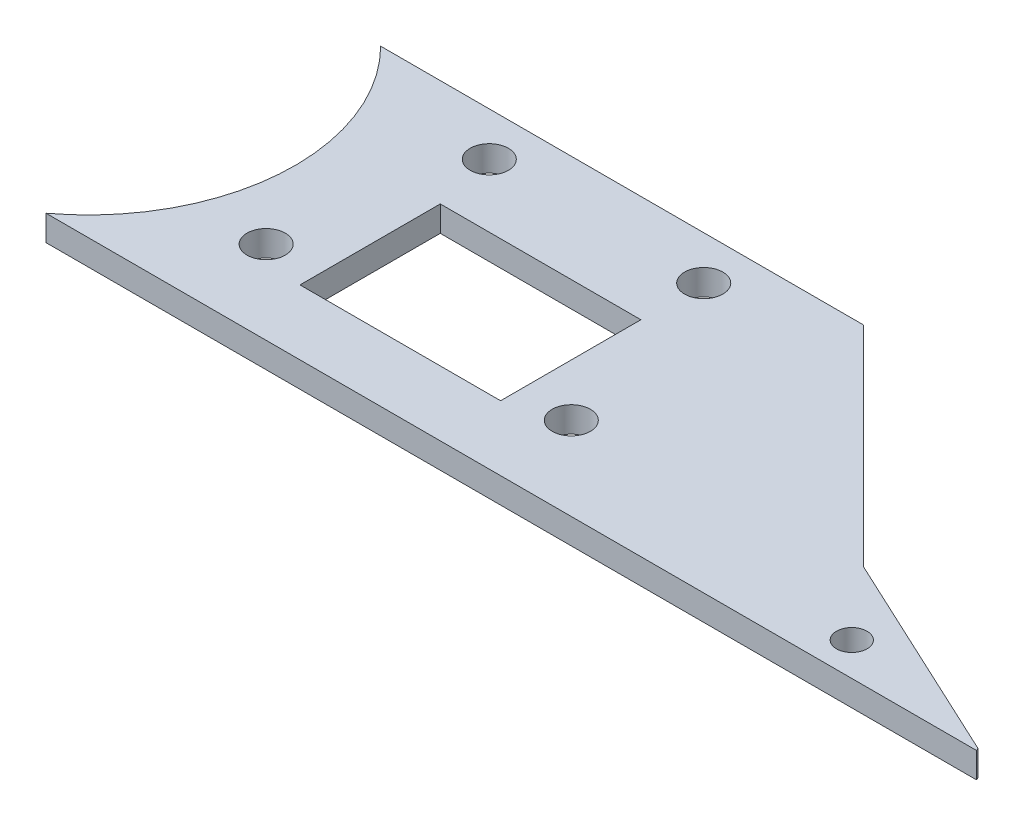
ISO-10303-21;
HEADER;
FILE_DESCRIPTION(('STEP AP214'),'2;1');
FILE_NAME('part.step','',(''),(''),'','','');
FILE_SCHEMA(('AUTOMOTIVE_DESIGN { 1 0 10303 214 1 1 1 1 }'));
ENDSEC;
DATA;
#1=APPLICATION_CONTEXT('core data for automotive mechanical design processes');
#2=APPLICATION_PROTOCOL_DEFINITION('international standard','automotive_design',2000,#1);
#3=PRODUCT_CONTEXT('',#1,'mechanical');
#4=PRODUCT('Part','Part','',(#3));
#5=PRODUCT_RELATED_PRODUCT_CATEGORY('part','',(#4));
#6=PRODUCT_DEFINITION_FORMATION('','',#4);
#7=PRODUCT_DEFINITION_CONTEXT('part definition',#1,'design');
#8=PRODUCT_DEFINITION('design','',#6,#7);
#9=PRODUCT_DEFINITION_SHAPE('','',#8);
#10=(LENGTH_UNIT() NAMED_UNIT(*) SI_UNIT(.MILLI.,.METRE.));
#11=(NAMED_UNIT(*) PLANE_ANGLE_UNIT() SI_UNIT($,.RADIAN.));
#12=(NAMED_UNIT(*) SI_UNIT($,.STERADIAN.) SOLID_ANGLE_UNIT());
#13=UNCERTAINTY_MEASURE_WITH_UNIT(LENGTH_MEASURE(1.E-05),#10,'distance_accuracy_value','');
#14=(GEOMETRIC_REPRESENTATION_CONTEXT(3) GLOBAL_UNCERTAINTY_ASSIGNED_CONTEXT((#13)) GLOBAL_UNIT_ASSIGNED_CONTEXT((#10,
#11,#12)) REPRESENTATION_CONTEXT('',''));
#15=CARTESIAN_POINT('',(0.,0.,0.));
#16=DIRECTION('',(0.,0.,1.));
#17=DIRECTION('',(1.,0.,0.));
#18=AXIS2_PLACEMENT_3D('',#15,#16,#17);
#19=CARTESIAN_POINT('',(-66.6007874639378,2.,10.8319569581962));
#20=DIRECTION('',(0.,1.,0.));
#21=DIRECTION('',(0.,0.,1.));
#22=AXIS2_PLACEMENT_3D('',#19,#20,#21);
#23=PLANE('',#22);
#24=CARTESIAN_POINT('',(3.65105756173379,2.,21.2246917080229));
#25=DIRECTION('',(0.,1.,0.));
#26=DIRECTION('',(0.,0.,1.));
#27=AXIS2_PLACEMENT_3D('',#24,#25,#26);
#28=CIRCLE('',#27,1.2);
#29=CARTESIAN_POINT('',(3.65105756173379,2.,22.4246917080229));
#30=VERTEX_POINT('',#29);
#31=EDGE_CURVE('E121',#30,#30,#28,.T.);
#32=ORIENTED_EDGE('',*,*,#31,.F.);
#33=EDGE_LOOP('',(#32));
#34=FACE_BOUND('',#33,.T.);
#35=CARTESIAN_POINT('',(-46.1933078237589,2.,17.2995690503924));
#36=DIRECTION('',(0.,1.,0.));
#37=DIRECTION('',(0.,0.,1.));
#38=AXIS2_PLACEMENT_3D('',#35,#36,#37);
#39=CIRCLE('',#38,1.5);
#40=CARTESIAN_POINT('',(-46.1933078237589,2.,18.7995690503924));
#41=VERTEX_POINT('',#40);
#42=EDGE_CURVE('E373',#41,#41,#39,.T.);
#43=ORIENTED_EDGE('',*,*,#42,.F.);
#44=EDGE_LOOP('',(#43));
#45=FACE_BOUND('',#44,.T.);
#46=CARTESIAN_POINT('',(-43.205666325321,2.,2.78979940431926));
#47=DIRECTION('',(0.,1.,0.));
#48=DIRECTION('',(0.,0.,1.));
#49=AXIS2_PLACEMENT_3D('',#46,#47,#48);
#50=CIRCLE('',#49,1.5);
#51=CARTESIAN_POINT('',(-43.205666325321,2.,4.28979940431926));
#52=VERTEX_POINT('',#51);
#53=EDGE_CURVE('E385',#52,#52,#50,.T.);
#54=ORIENTED_EDGE('',*,*,#53,.F.);
#55=EDGE_LOOP('',(#54));
#56=FACE_BOUND('',#55,.T.);
#57=DIRECTION('',(-1.,0.,0.));
#58=VECTOR('',#57,1.);
#59=CARTESIAN_POINT('',(-26.3661735280737,2.,7.74257945205895));
#60=LINE('',#59,#58);
#61=CARTESIAN_POINT('',(-26.3661735280737,2.,7.74257945205895));
#62=VERTEX_POINT('',#61);
#63=CARTESIAN_POINT('',(-42.096785232211,2.,7.74257945205895));
#64=VERTEX_POINT('',#63);
#65=EDGE_CURVE('E393',#62,#64,#60,.T.);
#66=ORIENTED_EDGE('',*,*,#65,.F.);
#67=DIRECTION('',(0.,0.,-1.));
#68=VECTOR('',#67,1.);
#69=CARTESIAN_POINT('',(-26.3661735280737,2.,7.74257945205895));
#70=LINE('',#69,#68);
#71=CARTESIAN_POINT('',(-26.3661735280737,2.,18.7425794520587));
#72=VERTEX_POINT('',#71);
#73=EDGE_CURVE('E391',#72,#62,#70,.T.);
#74=ORIENTED_EDGE('',*,*,#73,.F.);
#75=DIRECTION('',(1.,0.,0.));
#76=VECTOR('',#75,1.);
#77=CARTESIAN_POINT('',(-26.3661735280737,2.,18.7425794520587));
#78=LINE('',#77,#76);
#79=CARTESIAN_POINT('',(-42.096785232211,2.,18.7425794520587));
#80=VERTEX_POINT('',#79);
#81=EDGE_CURVE('E398',#80,#72,#78,.T.);
#82=ORIENTED_EDGE('',*,*,#81,.F.);
#83=DIRECTION('',(0.,0.,1.));
#84=VECTOR('',#83,1.);
#85=CARTESIAN_POINT('',(-42.096785232211,2.,7.74257945205895));
#86=LINE('',#85,#84);
#87=EDGE_CURVE('E396',#64,#80,#86,.T.);
#88=ORIENTED_EDGE('',*,*,#87,.F.);
#89=EDGE_LOOP('',(#66,#74,#82,#88));
#90=FACE_BOUND('',#89,.T.);
#91=CARTESIAN_POINT('',(-26.3930466209632,2.,2.78979940431926));
#92=DIRECTION('',(0.,1.,0.));
#93=DIRECTION('',(0.,0.,1.));
#94=AXIS2_PLACEMENT_3D('',#91,#92,#93);
#95=CIRCLE('',#94,1.5);
#96=CARTESIAN_POINT('',(-26.3930466209632,2.,4.28979940431925));
#97=VERTEX_POINT('',#96);
#98=EDGE_CURVE('E379',#97,#97,#95,.T.);
#99=ORIENTED_EDGE('',*,*,#98,.F.);
#100=EDGE_LOOP('',(#99));
#101=FACE_BOUND('',#100,.T.);
#102=CARTESIAN_POINT('',(-22.2661735280737,2.,17.2995690503924));
#103=DIRECTION('',(0.,1.,0.));
#104=DIRECTION('',(0.,0.,1.));
#105=AXIS2_PLACEMENT_3D('',#102,#103,#104);
#106=CIRCLE('',#105,1.5);
#107=CARTESIAN_POINT('',(-22.2661735280737,2.,18.7995690503924));
#108=VERTEX_POINT('',#107);
#109=EDGE_CURVE('E367',#108,#108,#106,.T.);
#110=ORIENTED_EDGE('',*,*,#109,.F.);
#111=EDGE_LOOP('',(#110));
#112=FACE_BOUND('',#111,.T.);
#113=DIRECTION('',(1.,0.,0.));
#114=VECTOR('',#113,1.);
#115=CARTESIAN_POINT('',(-56.923759365185,2.,23.8319569582002));
#116=LINE('',#115,#114);
#117=CARTESIAN_POINT('',(-56.923759365185,2.,23.8319569582002));
#118=VERTEX_POINT('',#117);
#119=CARTESIAN_POINT('',(16.0318963530946,2.,23.8319569582002));
#120=VERTEX_POINT('',#119);
#121=EDGE_CURVE('E142',#118,#120,#116,.T.);
#122=ORIENTED_EDGE('',*,*,#121,.T.);
#123=DIRECTION('',(-0.342020143325665,0.,-0.93969262078591));
#124=VECTOR('',#123,1.);
#125=CARTESIAN_POINT('',(2.18758911063748,2.,-14.2049645784433));
#126=LINE('',#125,#124);
#127=CARTESIAN_POINT('',(15.9601451609682,2.,23.6348221780139));
#128=VERTEX_POINT('',#127);
#129=EDGE_CURVE('E53',#120,#128,#126,.T.);
#130=ORIENTED_EDGE('',*,*,#129,.T.);
#131=DIRECTION('',(-0.906307787036571,0.,-0.422618261740869));
#132=VECTOR('',#131,1.);
#133=CARTESIAN_POINT('',(16.3829020613507,2.,23.8319569582002));
#134=LINE('',#133,#132);
#135=CARTESIAN_POINT('',(-0.836945892341522,2.,15.8022099851249));
#136=VERTEX_POINT('',#135);
#137=EDGE_CURVE('E128',#128,#136,#134,.T.);
#138=ORIENTED_EDGE('',*,*,#137,.T.);
#139=DIRECTION('',(-0.707106781186548,0.,-0.707106781186547));
#140=VECTOR('',#139,1.);
#141=CARTESIAN_POINT('',(-0.836945892341522,2.,15.8022099851249));
#142=LINE('',#141,#140);
#143=CARTESIAN_POINT('',(-17.2719747348862,2.,-0.632818857419724));
#144=VERTEX_POINT('',#143);
#145=EDGE_CURVE('E163',#136,#144,#142,.T.);
#146=ORIENTED_EDGE('',*,*,#145,.T.);
#147=DIRECTION('',(-1.,0.,0.));
#148=VECTOR('',#147,1.);
#149=CARTESIAN_POINT('',(-55.1463652470897,2.,-0.632818857419724));
#150=LINE('',#149,#148);
#151=CARTESIAN_POINT('',(-55.1463652470897,2.,-0.632818857419719));
#152=VERTEX_POINT('',#151);
#153=EDGE_CURVE('E166',#144,#152,#150,.T.);
#154=ORIENTED_EDGE('',*,*,#153,.T.);
#155=CARTESIAN_POINT('',(-66.6007874639378,2.,10.8319569581962));
#156=DIRECTION('',(0.,-1.,0.));
#157=DIRECTION('',(0.,0.,1.));
#158=AXIS2_PLACEMENT_3D('',#155,#156,#157);
#159=CIRCLE('',#158,16.2063220017422);
#160=EDGE_CURVE('E168',#152,#118,#159,.T.);
#161=ORIENTED_EDGE('',*,*,#160,.T.);
#162=EDGE_LOOP('',(#122,#130,#138,#146,#154,#161));
#163=FACE_BOUND('',#162,.T.);
#164=ADVANCED_FACE('F39',(#34,#45,#56,#90,#101,#112,#163),#23,.T.);
#165=CARTESIAN_POINT('',(-66.6007874639378,0.,10.8319569581962));
#166=DIRECTION('',(0.,1.,0.));
#167=DIRECTION('',(0.,0.,1.));
#168=AXIS2_PLACEMENT_3D('',#165,#166,#167);
#169=PLANE('',#168);
#170=CARTESIAN_POINT('',(3.65105756173379,0.,21.2246917080229));
#171=DIRECTION('',(0.,-1.,0.));
#172=DIRECTION('',(0.,0.,-1.));
#173=AXIS2_PLACEMENT_3D('',#170,#171,#172);
#174=CIRCLE('',#173,1.2);
#175=CARTESIAN_POINT('',(3.65105756173379,0.,20.0246917080229));
#176=VERTEX_POINT('',#175);
#177=EDGE_CURVE('E361',#176,#176,#174,.T.);
#178=ORIENTED_EDGE('',*,*,#177,.F.);
#179=EDGE_LOOP('',(#178));
#180=FACE_BOUND('',#179,.T.);
#181=CARTESIAN_POINT('',(-22.2661735280737,0.,17.2995690503924));
#182=DIRECTION('',(0.,1.,0.));
#183=DIRECTION('',(0.,0.,1.));
#184=AXIS2_PLACEMENT_3D('',#181,#182,#183);
#185=CIRCLE('',#184,1.5);
#186=CARTESIAN_POINT('',(-22.2661735280737,0.,18.7995690503924));
#187=VERTEX_POINT('',#186);
#188=EDGE_CURVE('E366',#187,#187,#185,.T.);
#189=ORIENTED_EDGE('',*,*,#188,.T.);
#190=EDGE_LOOP('',(#189));
#191=FACE_BOUND('',#190,.T.);
#192=CARTESIAN_POINT('',(-46.1933078237589,0.,17.2995690503924));
#193=DIRECTION('',(0.,1.,0.));
#194=DIRECTION('',(0.,0.,1.));
#195=AXIS2_PLACEMENT_3D('',#192,#193,#194);
#196=CIRCLE('',#195,1.5);
#197=CARTESIAN_POINT('',(-46.1933078237589,0.,18.7995690503924));
#198=VERTEX_POINT('',#197);
#199=EDGE_CURVE('E370',#198,#198,#196,.T.);
#200=ORIENTED_EDGE('',*,*,#199,.T.);
#201=EDGE_LOOP('',(#200));
#202=FACE_BOUND('',#201,.T.);
#203=CARTESIAN_POINT('',(-26.3930466209632,0.,2.78979940431926));
#204=DIRECTION('',(0.,1.,0.));
#205=DIRECTION('',(0.,0.,1.));
#206=AXIS2_PLACEMENT_3D('',#203,#204,#205);
#207=CIRCLE('',#206,1.5);
#208=CARTESIAN_POINT('',(-26.3930466209632,0.,4.28979940431925));
#209=VERTEX_POINT('',#208);
#210=EDGE_CURVE('E376',#209,#209,#207,.T.);
#211=ORIENTED_EDGE('',*,*,#210,.T.);
#212=EDGE_LOOP('',(#211));
#213=FACE_BOUND('',#212,.T.);
#214=CARTESIAN_POINT('',(-43.205666325321,0.,2.78979940431926));
#215=DIRECTION('',(0.,1.,0.));
#216=DIRECTION('',(0.,0.,1.));
#217=AXIS2_PLACEMENT_3D('',#214,#215,#216);
#218=CIRCLE('',#217,1.5);
#219=CARTESIAN_POINT('',(-43.205666325321,0.,4.28979940431926));
#220=VERTEX_POINT('',#219);
#221=EDGE_CURVE('E382',#220,#220,#218,.T.);
#222=ORIENTED_EDGE('',*,*,#221,.T.);
#223=EDGE_LOOP('',(#222));
#224=FACE_BOUND('',#223,.T.);
#225=DIRECTION('',(0.,0.,-1.));
#226=VECTOR('',#225,1.);
#227=CARTESIAN_POINT('',(-26.3661735280737,0.,7.74257945205895));
#228=LINE('',#227,#226);
#229=CARTESIAN_POINT('',(-26.3661735280737,0.,18.7425794520587));
#230=VERTEX_POINT('',#229);
#231=CARTESIAN_POINT('',(-26.3661735280737,0.,7.74257945205895));
#232=VERTEX_POINT('',#231);
#233=EDGE_CURVE('E388',#230,#232,#228,.T.);
#234=ORIENTED_EDGE('',*,*,#233,.T.);
#235=DIRECTION('',(-1.,0.,0.));
#236=VECTOR('',#235,1.);
#237=CARTESIAN_POINT('',(-26.3661735280737,0.,7.74257945205895));
#238=LINE('',#237,#236);
#239=CARTESIAN_POINT('',(-42.096785232211,0.,7.74257945205895));
#240=VERTEX_POINT('',#239);
#241=EDGE_CURVE('E403',#232,#240,#238,.T.);
#242=ORIENTED_EDGE('',*,*,#241,.T.);
#243=DIRECTION('',(0.,0.,1.));
#244=VECTOR('',#243,1.);
#245=CARTESIAN_POINT('',(-42.096785232211,0.,7.74257945205895));
#246=LINE('',#245,#244);
#247=CARTESIAN_POINT('',(-42.096785232211,0.,18.7425794520587));
#248=VERTEX_POINT('',#247);
#249=EDGE_CURVE('E406',#240,#248,#246,.T.);
#250=ORIENTED_EDGE('',*,*,#249,.T.);
#251=DIRECTION('',(1.,0.,0.));
#252=VECTOR('',#251,1.);
#253=CARTESIAN_POINT('',(-26.3661735280737,0.,18.7425794520587));
#254=LINE('',#253,#252);
#255=EDGE_CURVE('E394',#248,#230,#254,.T.);
#256=ORIENTED_EDGE('',*,*,#255,.T.);
#257=EDGE_LOOP('',(#234,#242,#250,#256));
#258=FACE_BOUND('',#257,.T.);
#259=DIRECTION('',(0.342020143325665,0.,0.93969262078591));
#260=VECTOR('',#259,1.);
#261=CARTESIAN_POINT('',(15.9601451609682,0.,23.6348221780139));
#262=LINE('',#261,#260);
#263=CARTESIAN_POINT('',(15.9601451609682,0.,23.6348221780139));
#264=VERTEX_POINT('',#263);
#265=CARTESIAN_POINT('',(16.0318963530946,0.,23.8319569582002));
#266=VERTEX_POINT('',#265);
#267=EDGE_CURVE('E113',#264,#266,#262,.T.);
#268=ORIENTED_EDGE('',*,*,#267,.T.);
#269=DIRECTION('',(1.,0.,0.));
#270=VECTOR('',#269,1.);
#271=CARTESIAN_POINT('',(-56.923759365185,0.,23.8319569582002));
#272=LINE('',#271,#270);
#273=CARTESIAN_POINT('',(-56.923759365185,0.,23.8319569582002));
#274=VERTEX_POINT('',#273);
#275=EDGE_CURVE('E149',#274,#266,#272,.T.);
#276=ORIENTED_EDGE('',*,*,#275,.F.);
#277=CARTESIAN_POINT('',(-66.6007874639378,0.,10.8319569581962));
#278=DIRECTION('',(0.,-1.,0.));
#279=DIRECTION('',(0.,0.,1.));
#280=AXIS2_PLACEMENT_3D('',#277,#278,#279);
#281=CIRCLE('',#280,16.2063220017422);
#282=CARTESIAN_POINT('',(-55.1463652470897,0.,-0.632818857419719));
#283=VERTEX_POINT('',#282);
#284=EDGE_CURVE('E147',#283,#274,#281,.T.);
#285=ORIENTED_EDGE('',*,*,#284,.F.);
#286=DIRECTION('',(-1.,0.,0.));
#287=VECTOR('',#286,1.);
#288=CARTESIAN_POINT('',(-55.1463652470897,0.,-0.632818857419724));
#289=LINE('',#288,#287);
#290=CARTESIAN_POINT('',(-17.2719747348862,0.,-0.632818857419724));
#291=VERTEX_POINT('',#290);
#292=EDGE_CURVE('E136',#291,#283,#289,.T.);
#293=ORIENTED_EDGE('',*,*,#292,.F.);
#294=DIRECTION('',(-0.707106781186548,0.,-0.707106781186547));
#295=VECTOR('',#294,1.);
#296=CARTESIAN_POINT('',(-0.836945892341522,0.,15.8022099851249));
#297=LINE('',#296,#295);
#298=CARTESIAN_POINT('',(-0.836945892341522,0.,15.8022099851249));
#299=VERTEX_POINT('',#298);
#300=EDGE_CURVE('E132',#299,#291,#297,.T.);
#301=ORIENTED_EDGE('',*,*,#300,.F.);
#302=DIRECTION('',(-0.906307787036571,0.,-0.422618261740869));
#303=VECTOR('',#302,1.);
#304=CARTESIAN_POINT('',(16.3829020613507,0.,23.8319569582002));
#305=LINE('',#304,#303);
#306=EDGE_CURVE('E126',#264,#299,#305,.T.);
#307=ORIENTED_EDGE('',*,*,#306,.F.);
#308=EDGE_LOOP('',(#268,#276,#285,#293,#301,#307));
#309=FACE_BOUND('',#308,.T.);
#310=ADVANCED_FACE('F130',(#180,#191,#202,#213,#224,#258,#309),#169,.F.);
#311=CARTESIAN_POINT('',(16.3829020613507,2.,23.8319569582002));
#312=DIRECTION('',(-0.422618261740869,0.,0.906307787036571));
#313=DIRECTION('',(0.906307787036571,0.,0.422618261740869));
#314=AXIS2_PLACEMENT_3D('',#311,#312,#313);
#315=PLANE('',#314);
#316=DIRECTION('',(0.,-1.,0.));
#317=VECTOR('',#316,1.);
#318=CARTESIAN_POINT('',(15.9601451609682,108.5,23.6348221780139));
#319=LINE('',#318,#317);
#320=EDGE_CURVE('E116',#128,#264,#319,.T.);
#321=ORIENTED_EDGE('',*,*,#320,.T.);
#322=ORIENTED_EDGE('',*,*,#306,.T.);
#323=DIRECTION('',(0.,-1.,0.));
#324=VECTOR('',#323,1.);
#325=CARTESIAN_POINT('',(-0.836945892341522,2.,15.8022099851249));
#326=LINE('',#325,#324);
#327=EDGE_CURVE('E47',#136,#299,#326,.T.);
#328=ORIENTED_EDGE('',*,*,#327,.F.);
#329=ORIENTED_EDGE('',*,*,#137,.F.);
#330=EDGE_LOOP('',(#321,#322,#328,#329));
#331=FACE_BOUND('',#330,.T.);
#332=ADVANCED_FACE('F41',(#331),#315,.F.);
#333=CARTESIAN_POINT('',(-56.923759365185,2.,23.8319569582002));
#334=DIRECTION('',(0.,0.,-1.));
#335=DIRECTION('',(-1.,0.,0.));
#336=AXIS2_PLACEMENT_3D('',#333,#334,#335);
#337=PLANE('',#336);
#338=DIRECTION('',(0.,-1.,0.));
#339=VECTOR('',#338,1.);
#340=CARTESIAN_POINT('',(16.0318963530946,2.,23.8319569582002));
#341=LINE('',#340,#339);
#342=EDGE_CURVE('E11',#120,#266,#341,.T.);
#343=ORIENTED_EDGE('',*,*,#342,.F.);
#344=ORIENTED_EDGE('',*,*,#121,.F.);
#345=DIRECTION('',(0.,-1.,0.));
#346=VECTOR('',#345,1.);
#347=CARTESIAN_POINT('',(-56.923759365185,2.,23.8319569582002));
#348=LINE('',#347,#346);
#349=EDGE_CURVE('E151',#118,#274,#348,.T.);
#350=ORIENTED_EDGE('',*,*,#349,.T.);
#351=ORIENTED_EDGE('',*,*,#275,.T.);
#352=EDGE_LOOP('',(#343,#344,#350,#351));
#353=FACE_BOUND('',#352,.T.);
#354=ADVANCED_FACE('F176',(#353),#337,.F.);
#355=CARTESIAN_POINT('',(-0.836945892341522,2.,15.8022099851249));
#356=DIRECTION('',(-0.707106781186547,0.,0.707106781186548));
#357=DIRECTION('',(0.707106781186548,0.,0.707106781186547));
#358=AXIS2_PLACEMENT_3D('',#355,#356,#357);
#359=PLANE('',#358);
#360=ORIENTED_EDGE('',*,*,#300,.T.);
#361=DIRECTION('',(0.,-1.,0.));
#362=VECTOR('',#361,1.);
#363=CARTESIAN_POINT('',(-17.2719747348862,2.,-0.632818857419724));
#364=LINE('',#363,#362);
#365=EDGE_CURVE('E157',#144,#291,#364,.T.);
#366=ORIENTED_EDGE('',*,*,#365,.F.);
#367=ORIENTED_EDGE('',*,*,#145,.F.);
#368=ORIENTED_EDGE('',*,*,#327,.T.);
#369=EDGE_LOOP('',(#360,#366,#367,#368));
#370=FACE_BOUND('',#369,.T.);
#371=ADVANCED_FACE('F161',(#370),#359,.F.);
#372=CARTESIAN_POINT('',(-55.1463652470897,2.,-0.632818857419724));
#373=DIRECTION('',(0.,0.,1.));
#374=DIRECTION('',(1.,0.,0.));
#375=AXIS2_PLACEMENT_3D('',#372,#373,#374);
#376=PLANE('',#375);
#377=ORIENTED_EDGE('',*,*,#292,.T.);
#378=DIRECTION('',(0.,-1.,0.));
#379=VECTOR('',#378,1.);
#380=CARTESIAN_POINT('',(-55.1463652470897,2.,-0.632818857419719));
#381=LINE('',#380,#379);
#382=EDGE_CURVE('E154',#152,#283,#381,.T.);
#383=ORIENTED_EDGE('',*,*,#382,.F.);
#384=ORIENTED_EDGE('',*,*,#153,.F.);
#385=ORIENTED_EDGE('',*,*,#365,.T.);
#386=EDGE_LOOP('',(#377,#383,#384,#385));
#387=FACE_BOUND('',#386,.T.);
#388=ADVANCED_FACE('F180',(#387),#376,.F.);
#389=CARTESIAN_POINT('',(-66.6007874639378,2.,10.8319569581962));
#390=DIRECTION('',(0.,-1.,0.));
#391=DIRECTION('',(0.,0.,-1.));
#392=AXIS2_PLACEMENT_3D('',#389,#390,#391);
#393=CYLINDRICAL_SURFACE('',#392,16.2063220017422);
#394=ORIENTED_EDGE('',*,*,#284,.T.);
#395=ORIENTED_EDGE('',*,*,#349,.F.);
#396=ORIENTED_EDGE('',*,*,#160,.F.);
#397=ORIENTED_EDGE('',*,*,#382,.T.);
#398=EDGE_LOOP('',(#394,#395,#396,#397));
#399=FACE_BOUND('',#398,.T.);
#400=ADVANCED_FACE('F181',(#399),#393,.F.);
#401=CARTESIAN_POINT('',(-26.3661735280737,2.,7.74257945205895));
#402=DIRECTION('',(-1.,0.,0.));
#403=DIRECTION('',(0.,0.,1.));
#404=AXIS2_PLACEMENT_3D('',#401,#402,#403);
#405=PLANE('',#404);
#406=ORIENTED_EDGE('',*,*,#233,.F.);
#407=DIRECTION('',(0.,-1.,0.));
#408=VECTOR('',#407,1.);
#409=CARTESIAN_POINT('',(-26.3661735280737,2.,18.7425794520587));
#410=LINE('',#409,#408);
#411=EDGE_CURVE('E400',#72,#230,#410,.T.);
#412=ORIENTED_EDGE('',*,*,#411,.F.);
#413=ORIENTED_EDGE('',*,*,#73,.T.);
#414=DIRECTION('',(0.,-1.,0.));
#415=VECTOR('',#414,1.);
#416=CARTESIAN_POINT('',(-26.3661735280737,2.,7.74257945205895));
#417=LINE('',#416,#415);
#418=EDGE_CURVE('E134',#62,#232,#417,.T.);
#419=ORIENTED_EDGE('',*,*,#418,.T.);
#420=EDGE_LOOP('',(#406,#412,#413,#419));
#421=FACE_BOUND('',#420,.T.);
#422=ADVANCED_FACE('F183',(#421),#405,.T.);
#423=CARTESIAN_POINT('',(-26.3661735280737,2.,7.74257945205895));
#424=DIRECTION('',(0.,0.,1.));
#425=DIRECTION('',(1.,0.,0.));
#426=AXIS2_PLACEMENT_3D('',#423,#424,#425);
#427=PLANE('',#426);
#428=ORIENTED_EDGE('',*,*,#241,.F.);
#429=ORIENTED_EDGE('',*,*,#418,.F.);
#430=ORIENTED_EDGE('',*,*,#65,.T.);
#431=DIRECTION('',(0.,-1.,0.));
#432=VECTOR('',#431,1.);
#433=CARTESIAN_POINT('',(-42.096785232211,2.,7.74257945205895));
#434=LINE('',#433,#432);
#435=EDGE_CURVE('E139',#64,#240,#434,.T.);
#436=ORIENTED_EDGE('',*,*,#435,.T.);
#437=EDGE_LOOP('',(#428,#429,#430,#436));
#438=FACE_BOUND('',#437,.T.);
#439=ADVANCED_FACE('F189',(#438),#427,.T.);
#440=CARTESIAN_POINT('',(-42.096785232211,2.,7.74257945205895));
#441=DIRECTION('',(1.,0.,0.));
#442=DIRECTION('',(0.,0.,-1.));
#443=AXIS2_PLACEMENT_3D('',#440,#441,#442);
#444=PLANE('',#443);
#445=ORIENTED_EDGE('',*,*,#249,.F.);
#446=ORIENTED_EDGE('',*,*,#435,.F.);
#447=ORIENTED_EDGE('',*,*,#87,.T.);
#448=DIRECTION('',(0.,-1.,0.));
#449=VECTOR('',#448,1.);
#450=CARTESIAN_POINT('',(-42.096785232211,2.,18.7425794520587));
#451=LINE('',#450,#449);
#452=EDGE_CURVE('E61',#80,#248,#451,.T.);
#453=ORIENTED_EDGE('',*,*,#452,.T.);
#454=EDGE_LOOP('',(#445,#446,#447,#453));
#455=FACE_BOUND('',#454,.T.);
#456=ADVANCED_FACE('F294',(#455),#444,.T.);
#457=CARTESIAN_POINT('',(-26.3661735280737,2.,18.7425794520587));
#458=DIRECTION('',(0.,0.,-1.));
#459=DIRECTION('',(-1.,0.,0.));
#460=AXIS2_PLACEMENT_3D('',#457,#458,#459);
#461=PLANE('',#460);
#462=ORIENTED_EDGE('',*,*,#255,.F.);
#463=ORIENTED_EDGE('',*,*,#452,.F.);
#464=ORIENTED_EDGE('',*,*,#81,.T.);
#465=ORIENTED_EDGE('',*,*,#411,.T.);
#466=EDGE_LOOP('',(#462,#463,#464,#465));
#467=FACE_BOUND('',#466,.T.);
#468=ADVANCED_FACE('F284',(#467),#461,.T.);
#469=CARTESIAN_POINT('',(-43.205666325321,2.,2.78979940431926));
#470=DIRECTION('',(0.,-1.,0.));
#471=DIRECTION('',(0.,0.,-1.));
#472=AXIS2_PLACEMENT_3D('',#469,#470,#471);
#473=CYLINDRICAL_SURFACE('',#472,1.5);
#474=ORIENTED_EDGE('',*,*,#53,.T.);
#475=EDGE_LOOP('',(#474));
#476=FACE_BOUND('',#475,.T.);
#477=ORIENTED_EDGE('',*,*,#221,.F.);
#478=EDGE_LOOP('',(#477));
#479=FACE_BOUND('',#478,.T.);
#480=ADVANCED_FACE('F274',(#476,#479),#473,.F.);
#481=CARTESIAN_POINT('',(-26.3930466209632,2.,2.78979940431926));
#482=DIRECTION('',(0.,-1.,0.));
#483=DIRECTION('',(0.,0.,-1.));
#484=AXIS2_PLACEMENT_3D('',#481,#482,#483);
#485=CYLINDRICAL_SURFACE('',#484,1.5);
#486=ORIENTED_EDGE('',*,*,#98,.T.);
#487=EDGE_LOOP('',(#486));
#488=FACE_BOUND('',#487,.T.);
#489=ORIENTED_EDGE('',*,*,#210,.F.);
#490=EDGE_LOOP('',(#489));
#491=FACE_BOUND('',#490,.T.);
#492=ADVANCED_FACE('F264',(#488,#491),#485,.F.);
#493=CARTESIAN_POINT('',(-46.1933078237589,2.,17.2995690503924));
#494=DIRECTION('',(0.,-1.,0.));
#495=DIRECTION('',(0.,0.,-1.));
#496=AXIS2_PLACEMENT_3D('',#493,#494,#495);
#497=CYLINDRICAL_SURFACE('',#496,1.5);
#498=ORIENTED_EDGE('',*,*,#42,.T.);
#499=EDGE_LOOP('',(#498));
#500=FACE_BOUND('',#499,.T.);
#501=ORIENTED_EDGE('',*,*,#199,.F.);
#502=EDGE_LOOP('',(#501));
#503=FACE_BOUND('',#502,.T.);
#504=ADVANCED_FACE('F254',(#500,#503),#497,.F.);
#505=CARTESIAN_POINT('',(-22.2661735280737,2.,17.2995690503924));
#506=DIRECTION('',(0.,-1.,0.));
#507=DIRECTION('',(0.,0.,-1.));
#508=AXIS2_PLACEMENT_3D('',#505,#506,#507);
#509=CYLINDRICAL_SURFACE('',#508,1.5);
#510=ORIENTED_EDGE('',*,*,#109,.T.);
#511=EDGE_LOOP('',(#510));
#512=FACE_BOUND('',#511,.T.);
#513=ORIENTED_EDGE('',*,*,#188,.F.);
#514=EDGE_LOOP('',(#513));
#515=FACE_BOUND('',#514,.T.);
#516=ADVANCED_FACE('F233',(#512,#515),#509,.F.);
#517=CARTESIAN_POINT('',(15.9601451609682,108.5,23.6348221780139));
#518=DIRECTION('',(0.93969262078591,0.,-0.342020143325665));
#519=DIRECTION('',(-0.342020143325665,0.,-0.93969262078591));
#520=AXIS2_PLACEMENT_3D('',#517,#518,#519);
#521=PLANE('',#520);
#522=ORIENTED_EDGE('',*,*,#342,.T.);
#523=ORIENTED_EDGE('',*,*,#267,.F.);
#524=ORIENTED_EDGE('',*,*,#320,.F.);
#525=ORIENTED_EDGE('',*,*,#129,.F.);
#526=EDGE_LOOP('',(#522,#523,#524,#525));
#527=FACE_BOUND('',#526,.T.);
#528=ADVANCED_FACE('F115',(#527),#521,.T.);
#529=CARTESIAN_POINT('',(3.65105756173379,15.,21.2246917080229));
#530=DIRECTION('',(0.,-1.,0.));
#531=DIRECTION('',(0.,0.,-1.));
#532=AXIS2_PLACEMENT_3D('',#529,#530,#531);
#533=CYLINDRICAL_SURFACE('',#532,1.2);
#534=ORIENTED_EDGE('',*,*,#31,.T.);
#535=EDGE_LOOP('',(#534));
#536=FACE_BOUND('',#535,.T.);
#537=ORIENTED_EDGE('',*,*,#177,.T.);
#538=EDGE_LOOP('',(#537));
#539=FACE_BOUND('',#538,.T.);
#540=ADVANCED_FACE('F232',(#536,#539),#533,.F.);
#541=CLOSED_SHELL('',(#164,#310,#332,#354,#371,#388,#400,#422,#439,#456,#468,#480,#492,#504,
#516,#528,#540));
#542=MANIFOLD_SOLID_BREP('B2',#541);
#543=ADVANCED_BREP_SHAPE_REPRESENTATION('',(#18,#542),#14);
#544=SHAPE_DEFINITION_REPRESENTATION(#9,#543);
ENDSEC;
END-ISO-10303-21;
